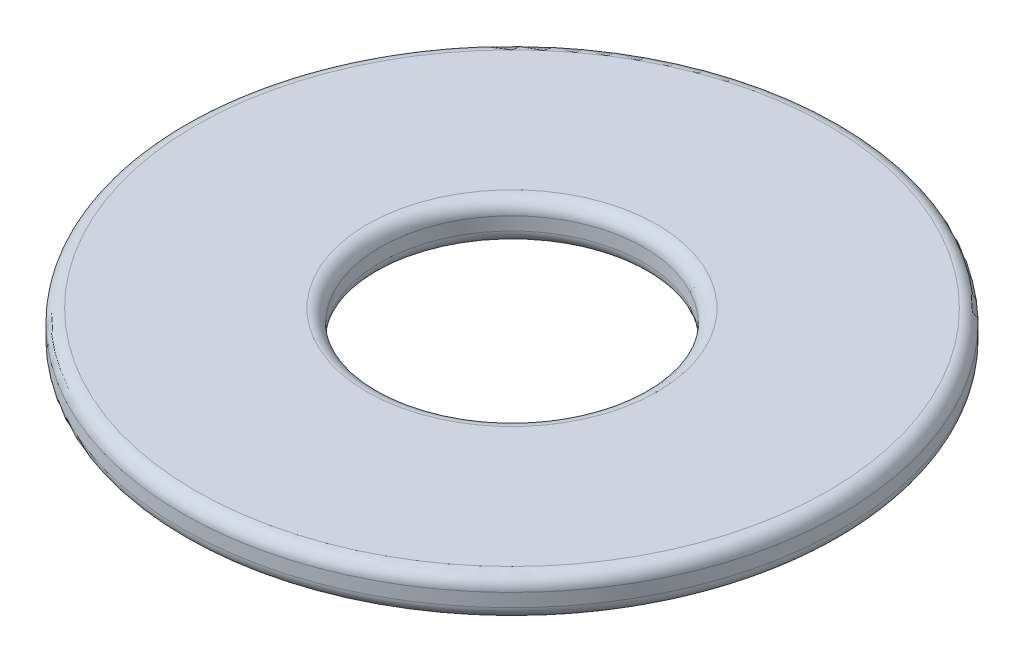
ISO-10303-21;
HEADER;
FILE_DESCRIPTION(('STEP AP214'),'2;1');
FILE_NAME('part.step','',(''),(''),'','','');
FILE_SCHEMA(('AUTOMOTIVE_DESIGN { 1 0 10303 214 1 1 1 1 }'));
ENDSEC;
DATA;
#1=APPLICATION_CONTEXT('core data for automotive mechanical design processes');
#2=APPLICATION_PROTOCOL_DEFINITION('international standard','automotive_design',2000,#1);
#3=PRODUCT_CONTEXT('',#1,'mechanical');
#4=PRODUCT('Part','Part','',(#3));
#5=PRODUCT_RELATED_PRODUCT_CATEGORY('part','',(#4));
#6=PRODUCT_DEFINITION_FORMATION('','',#4);
#7=PRODUCT_DEFINITION_CONTEXT('part definition',#1,'design');
#8=PRODUCT_DEFINITION('design','',#6,#7);
#9=PRODUCT_DEFINITION_SHAPE('','',#8);
#10=(LENGTH_UNIT() NAMED_UNIT(*) SI_UNIT(.MILLI.,.METRE.));
#11=(NAMED_UNIT(*) PLANE_ANGLE_UNIT() SI_UNIT($,.RADIAN.));
#12=(NAMED_UNIT(*) SI_UNIT($,.STERADIAN.) SOLID_ANGLE_UNIT());
#13=UNCERTAINTY_MEASURE_WITH_UNIT(LENGTH_MEASURE(1.E-05),#10,'distance_accuracy_value','');
#14=(GEOMETRIC_REPRESENTATION_CONTEXT(3) GLOBAL_UNCERTAINTY_ASSIGNED_CONTEXT((#13)) GLOBAL_UNIT_ASSIGNED_CONTEXT((#10,
#11,#12)) REPRESENTATION_CONTEXT('',''));
#15=CARTESIAN_POINT('',(0.,0.,0.));
#16=DIRECTION('',(0.,0.,1.));
#17=DIRECTION('',(1.,0.,0.));
#18=AXIS2_PLACEMENT_3D('',#15,#16,#17);
#19=CARTESIAN_POINT('',(0.,1.2,0.));
#20=DIRECTION('',(0.,1.,0.));
#21=DIRECTION('',(0.,0.,1.));
#22=AXIS2_PLACEMENT_3D('',#19,#20,#21);
#23=PLANE('',#22);
#24=CARTESIAN_POINT('',(0.,1.2,0.));
#25=DIRECTION('',(0.,1.,0.));
#26=DIRECTION('',(0.,0.,1.));
#27=AXIS2_PLACEMENT_3D('',#24,#25,#26);
#28=CIRCLE('',#27,4.4);
#29=CARTESIAN_POINT('',(0.,1.2,4.4));
#30=VERTEX_POINT('',#29);
#31=EDGE_CURVE('E45',#30,#30,#28,.F.);
#32=ORIENTED_EDGE('',*,*,#31,.T.);
#33=EDGE_LOOP('',(#32));
#34=FACE_BOUND('',#33,.T.);
#35=CARTESIAN_POINT('',(0.,1.2,0.));
#36=DIRECTION('',(0.,1.,0.));
#37=DIRECTION('',(0.,0.,1.));
#38=AXIS2_PLACEMENT_3D('',#35,#36,#37);
#39=CIRCLE('',#38,9.6);
#40=CARTESIAN_POINT('',(0.,1.2,9.6));
#41=VERTEX_POINT('',#40);
#42=EDGE_CURVE('E49',#41,#41,#39,.T.);
#43=ORIENTED_EDGE('',*,*,#42,.T.);
#44=EDGE_LOOP('',(#43));
#45=FACE_BOUND('',#44,.T.);
#46=ADVANCED_FACE('F34',(#34,#45),#23,.T.);
#47=CARTESIAN_POINT('',(0.,0.,0.));
#48=DIRECTION('',(0.,1.,0.));
#49=DIRECTION('',(0.,0.,1.));
#50=AXIS2_PLACEMENT_3D('',#47,#48,#49);
#51=PLANE('',#50);
#52=CARTESIAN_POINT('',(0.,0.,0.));
#53=DIRECTION('',(0.,1.,0.));
#54=DIRECTION('',(0.,0.,1.));
#55=AXIS2_PLACEMENT_3D('',#52,#53,#54);
#56=CIRCLE('',#55,4.4);
#57=CARTESIAN_POINT('',(0.,0.,4.4));
#58=VERTEX_POINT('',#57);
#59=EDGE_CURVE('E60',#58,#58,#56,.T.);
#60=ORIENTED_EDGE('',*,*,#59,.T.);
#61=EDGE_LOOP('',(#60));
#62=FACE_BOUND('',#61,.T.);
#63=CARTESIAN_POINT('',(0.,0.,0.));
#64=DIRECTION('',(0.,1.,0.));
#65=DIRECTION('',(0.,0.,1.));
#66=AXIS2_PLACEMENT_3D('',#63,#64,#65);
#67=CIRCLE('',#66,9.6);
#68=CARTESIAN_POINT('',(0.,0.,9.6));
#69=VERTEX_POINT('',#68);
#70=EDGE_CURVE('E63',#69,#69,#67,.F.);
#71=ORIENTED_EDGE('',*,*,#70,.T.);
#72=EDGE_LOOP('',(#71));
#73=FACE_BOUND('',#72,.T.);
#74=ADVANCED_FACE('F67',(#62,#73),#51,.F.);
#75=CARTESIAN_POINT('',(0.,1.2,0.));
#76=DIRECTION('',(0.,-1.,0.));
#77=DIRECTION('',(0.,0.,-1.));
#78=AXIS2_PLACEMENT_3D('',#75,#76,#77);
#79=CYLINDRICAL_SURFACE('',#78,10.);
#80=CARTESIAN_POINT('',(0.,0.4,0.));
#81=DIRECTION('',(0.,1.,0.));
#82=DIRECTION('',(0.,0.,1.));
#83=AXIS2_PLACEMENT_3D('',#80,#81,#82);
#84=CIRCLE('',#83,10.);
#85=CARTESIAN_POINT('',(0.,0.4,10.));
#86=VERTEX_POINT('',#85);
#87=EDGE_CURVE('E10',#86,#86,#84,.T.);
#88=ORIENTED_EDGE('',*,*,#87,.T.);
#89=EDGE_LOOP('',(#88));
#90=FACE_BOUND('',#89,.T.);
#91=CARTESIAN_POINT('',(0.,0.8,0.));
#92=DIRECTION('',(0.,1.,0.));
#93=DIRECTION('',(0.,0.,1.));
#94=AXIS2_PLACEMENT_3D('',#91,#92,#93);
#95=CIRCLE('',#94,10.);
#96=CARTESIAN_POINT('',(0.,0.8,10.));
#97=VERTEX_POINT('',#96);
#98=EDGE_CURVE('E41',#97,#97,#95,.F.);
#99=ORIENTED_EDGE('',*,*,#98,.T.);
#100=EDGE_LOOP('',(#99));
#101=FACE_BOUND('',#100,.T.);
#102=ADVANCED_FACE('F87',(#90,#101),#79,.T.);
#103=CARTESIAN_POINT('',(0.,1.2,0.));
#104=DIRECTION('',(0.,-1.,0.));
#105=DIRECTION('',(0.,0.,-1.));
#106=AXIS2_PLACEMENT_3D('',#103,#104,#105);
#107=CYLINDRICAL_SURFACE('',#106,4.);
#108=CARTESIAN_POINT('',(0.,0.4,0.));
#109=DIRECTION('',(0.,1.,0.));
#110=DIRECTION('',(0.,0.,1.));
#111=AXIS2_PLACEMENT_3D('',#108,#109,#110);
#112=CIRCLE('',#111,4.);
#113=CARTESIAN_POINT('',(0.,0.4,4.));
#114=VERTEX_POINT('',#113);
#115=EDGE_CURVE('E54',#114,#114,#112,.F.);
#116=ORIENTED_EDGE('',*,*,#115,.T.);
#117=EDGE_LOOP('',(#116));
#118=FACE_BOUND('',#117,.T.);
#119=CARTESIAN_POINT('',(0.,0.8,0.));
#120=DIRECTION('',(0.,1.,0.));
#121=DIRECTION('',(0.,0.,1.));
#122=AXIS2_PLACEMENT_3D('',#119,#120,#121);
#123=CIRCLE('',#122,4.);
#124=CARTESIAN_POINT('',(0.,0.8,4.));
#125=VERTEX_POINT('',#124);
#126=EDGE_CURVE('E57',#125,#125,#123,.T.);
#127=ORIENTED_EDGE('',*,*,#126,.T.);
#128=EDGE_LOOP('',(#127));
#129=FACE_BOUND('',#128,.T.);
#130=ADVANCED_FACE('F92',(#118,#129),#107,.F.);
#131=CARTESIAN_POINT('',(0.,0.4,0.));
#132=DIRECTION('',(0.,1.,0.));
#133=DIRECTION('',(0.,0.,1.));
#134=AXIS2_PLACEMENT_3D('',#131,#132,#133);
#135=TOROIDAL_SURFACE('',#134,4.4,0.4);
#136=ORIENTED_EDGE('',*,*,#115,.F.);
#137=EDGE_LOOP('',(#136));
#138=FACE_BOUND('',#137,.T.);
#139=ORIENTED_EDGE('',*,*,#59,.F.);
#140=EDGE_LOOP('',(#139));
#141=FACE_BOUND('',#140,.T.);
#142=ADVANCED_FACE('F78',(#138,#141),#135,.T.);
#143=CARTESIAN_POINT('',(0.,0.8,0.));
#144=DIRECTION('',(0.,1.,0.));
#145=DIRECTION('',(0.,0.,1.));
#146=AXIS2_PLACEMENT_3D('',#143,#144,#145);
#147=TOROIDAL_SURFACE('',#146,4.4,0.4);
#148=ORIENTED_EDGE('',*,*,#31,.F.);
#149=EDGE_LOOP('',(#148));
#150=FACE_BOUND('',#149,.T.);
#151=ORIENTED_EDGE('',*,*,#126,.F.);
#152=EDGE_LOOP('',(#151));
#153=FACE_BOUND('',#152,.T.);
#154=ADVANCED_FACE('F72',(#150,#153),#147,.T.);
#155=CARTESIAN_POINT('',(0.,0.4,0.));
#156=DIRECTION('',(0.,1.,0.));
#157=DIRECTION('',(0.,0.,1.));
#158=AXIS2_PLACEMENT_3D('',#155,#156,#157);
#159=TOROIDAL_SURFACE('',#158,9.6,0.4);
#160=ORIENTED_EDGE('',*,*,#70,.F.);
#161=EDGE_LOOP('',(#160));
#162=FACE_BOUND('',#161,.T.);
#163=ORIENTED_EDGE('',*,*,#87,.F.);
#164=EDGE_LOOP('',(#163));
#165=FACE_BOUND('',#164,.T.);
#166=ADVANCED_FACE('F69',(#162,#165),#159,.T.);
#167=CARTESIAN_POINT('',(0.,0.8,0.));
#168=DIRECTION('',(0.,1.,0.));
#169=DIRECTION('',(0.,0.,1.));
#170=AXIS2_PLACEMENT_3D('',#167,#168,#169);
#171=TOROIDAL_SURFACE('',#170,9.6,0.4);
#172=ORIENTED_EDGE('',*,*,#98,.F.);
#173=EDGE_LOOP('',(#172));
#174=FACE_BOUND('',#173,.T.);
#175=ORIENTED_EDGE('',*,*,#42,.F.);
#176=EDGE_LOOP('',(#175));
#177=FACE_BOUND('',#176,.T.);
#178=ADVANCED_FACE('F36',(#174,#177),#171,.T.);
#179=CLOSED_SHELL('',(#46,#74,#102,#130,#142,#154,#166,#178));
#180=MANIFOLD_SOLID_BREP('B2',#179);
#181=ADVANCED_BREP_SHAPE_REPRESENTATION('',(#18,#180),#14);
#182=SHAPE_DEFINITION_REPRESENTATION(#9,#181);
ENDSEC;
END-ISO-10303-21;
